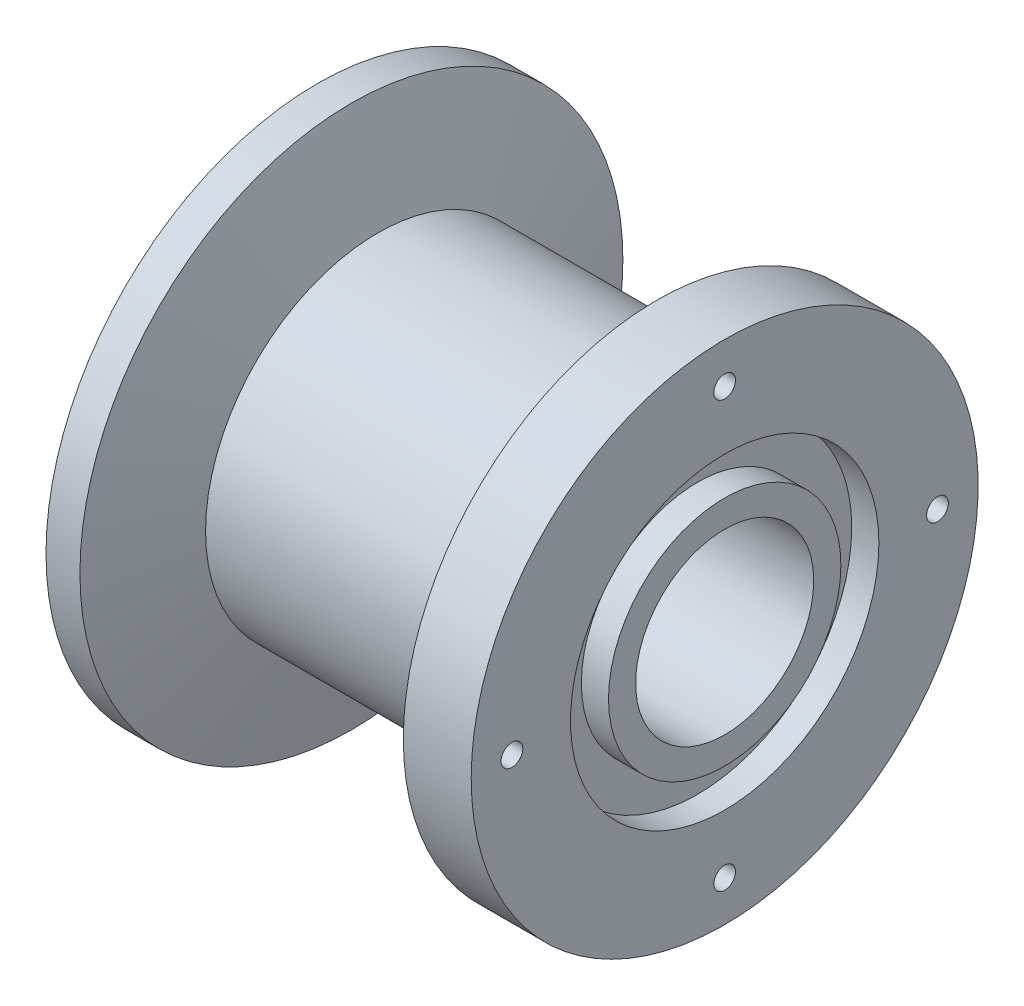
ISO-10303-21;
HEADER;
FILE_DESCRIPTION(('STEP AP214'),'2;1');
FILE_NAME('part.step','',(''),(''),'','','');
FILE_SCHEMA(('AUTOMOTIVE_DESIGN { 1 0 10303 214 1 1 1 1 }'));
ENDSEC;
DATA;
#1=APPLICATION_CONTEXT('core data for automotive mechanical design processes');
#2=APPLICATION_PROTOCOL_DEFINITION('international standard','automotive_design',2000,#1);
#3=PRODUCT_CONTEXT('',#1,'mechanical');
#4=PRODUCT('Part','Part','',(#3));
#5=PRODUCT_RELATED_PRODUCT_CATEGORY('part','',(#4));
#6=PRODUCT_DEFINITION_FORMATION('','',#4);
#7=PRODUCT_DEFINITION_CONTEXT('part definition',#1,'design');
#8=PRODUCT_DEFINITION('design','',#6,#7);
#9=PRODUCT_DEFINITION_SHAPE('','',#8);
#10=(LENGTH_UNIT() NAMED_UNIT(*) SI_UNIT(.MILLI.,.METRE.));
#11=(NAMED_UNIT(*) PLANE_ANGLE_UNIT() SI_UNIT($,.RADIAN.));
#12=(NAMED_UNIT(*) SI_UNIT($,.STERADIAN.) SOLID_ANGLE_UNIT());
#13=UNCERTAINTY_MEASURE_WITH_UNIT(LENGTH_MEASURE(1.E-05),#10,'distance_accuracy_value','');
#14=(GEOMETRIC_REPRESENTATION_CONTEXT(3) GLOBAL_UNCERTAINTY_ASSIGNED_CONTEXT((#13)) GLOBAL_UNIT_ASSIGNED_CONTEXT((#10,
#11,#12)) REPRESENTATION_CONTEXT('',''));
#15=CARTESIAN_POINT('',(0.,0.,0.));
#16=DIRECTION('',(0.,0.,1.));
#17=DIRECTION('',(1.,0.,0.));
#18=AXIS2_PLACEMENT_3D('',#15,#16,#17);
#19=CARTESIAN_POINT('',(27.9999999981352,0.,0.));
#20=DIRECTION('',(1.,0.,0.));
#21=DIRECTION('',(0.,0.,-1.));
#22=AXIS2_PLACEMENT_3D('',#19,#20,#21);
#23=CYLINDRICAL_SURFACE('',#22,11.3599999992398);
#24=CARTESIAN_POINT('',(29.999999998002,0.,0.));
#25=DIRECTION('',(1.,0.,0.));
#26=DIRECTION('',(0.,0.,-1.));
#27=AXIS2_PLACEMENT_3D('',#24,#25,#26);
#28=CIRCLE('',#27,11.3599999992398);
#29=CARTESIAN_POINT('',(29.999999998002,0.,-11.3599999992398));
#30=VERTEX_POINT('',#29);
#31=EDGE_CURVE('E36',#30,#30,#28,.T.);
#32=ORIENTED_EDGE('',*,*,#31,.T.);
#33=EDGE_LOOP('',(#32));
#34=FACE_BOUND('',#33,.T.);
#35=CARTESIAN_POINT('',(27.9999999981352,0.,0.));
#36=DIRECTION('',(1.,0.,0.));
#37=DIRECTION('',(0.,0.,-1.));
#38=AXIS2_PLACEMENT_3D('',#35,#36,#37);
#39=CIRCLE('',#38,11.3599999992398);
#40=CARTESIAN_POINT('',(27.9999999981352,0.,-11.3599999992398));
#41=VERTEX_POINT('',#40);
#42=EDGE_CURVE('E98',#41,#41,#39,.F.);
#43=ORIENTED_EDGE('',*,*,#42,.T.);
#44=EDGE_LOOP('',(#43));
#45=FACE_BOUND('',#44,.T.);
#46=ADVANCED_FACE('F32',(#34,#45),#23,.F.);
#47=CARTESIAN_POINT('',(29.999999998002,-19.4431846785478,19.4431846785478));
#48=DIRECTION('',(1.,0.,0.));
#49=DIRECTION('',(0.,0.,-1.));
#50=AXIS2_PLACEMENT_3D('',#47,#48,#49);
#51=PLANE('',#50);
#52=CARTESIAN_POINT('',(29.999999998002,-15.6749999989552,0.));
#53=DIRECTION('',(-1.,0.,0.));
#54=DIRECTION('',(0.,0.,1.));
#55=AXIS2_PLACEMENT_3D('',#52,#53,#54);
#56=CIRCLE('',#55,0.79999999993427);
#57=CARTESIAN_POINT('',(29.999999998002,-15.6749999989552,0.79999999993427));
#58=VERTEX_POINT('',#57);
#59=EDGE_CURVE('E84',#58,#58,#56,.T.);
#60=ORIENTED_EDGE('',*,*,#59,.T.);
#61=EDGE_LOOP('',(#60));
#62=FACE_BOUND('',#61,.T.);
#63=CARTESIAN_POINT('',(29.999999998002,0.,-15.6749999989552));
#64=DIRECTION('',(-1.,0.,0.));
#65=DIRECTION('',(0.,0.,1.));
#66=AXIS2_PLACEMENT_3D('',#63,#64,#65);
#67=CIRCLE('',#66,0.79999999993427);
#68=CARTESIAN_POINT('',(29.999999998002,0.,-14.8749999990209));
#69=VERTEX_POINT('',#68);
#70=EDGE_CURVE('E87',#69,#69,#67,.T.);
#71=ORIENTED_EDGE('',*,*,#70,.T.);
#72=EDGE_LOOP('',(#71));
#73=FACE_BOUND('',#72,.T.);
#74=CARTESIAN_POINT('',(29.999999998002,0.,15.6749999989552));
#75=DIRECTION('',(-1.,0.,0.));
#76=DIRECTION('',(0.,0.,1.));
#77=AXIS2_PLACEMENT_3D('',#74,#75,#76);
#78=CIRCLE('',#77,0.79999999993427);
#79=CARTESIAN_POINT('',(29.999999998002,0.,16.4749999988895));
#80=VERTEX_POINT('',#79);
#81=EDGE_CURVE('E90',#80,#80,#78,.T.);
#82=ORIENTED_EDGE('',*,*,#81,.T.);
#83=EDGE_LOOP('',(#82));
#84=FACE_BOUND('',#83,.T.);
#85=CARTESIAN_POINT('',(29.999999998002,15.6749999989552,0.));
#86=DIRECTION('',(-1.,0.,0.));
#87=DIRECTION('',(0.,0.,1.));
#88=AXIS2_PLACEMENT_3D('',#85,#86,#87);
#89=CIRCLE('',#88,0.79999999993427);
#90=CARTESIAN_POINT('',(29.999999998002,15.6749999989552,0.79999999993427));
#91=VERTEX_POINT('',#90);
#92=EDGE_CURVE('E93',#91,#91,#89,.T.);
#93=ORIENTED_EDGE('',*,*,#92,.T.);
#94=EDGE_LOOP('',(#93));
#95=FACE_BOUND('',#94,.T.);
#96=ORIENTED_EDGE('',*,*,#31,.F.);
#97=EDGE_LOOP('',(#96));
#98=FACE_BOUND('',#97,.T.);
#99=CARTESIAN_POINT('',(29.999999998002,0.,0.));
#100=DIRECTION('',(-1.,0.,0.));
#101=DIRECTION('',(0.,0.,1.));
#102=AXIS2_PLACEMENT_3D('',#99,#100,#101);
#103=CIRCLE('',#102,18.674999998809);
#104=CARTESIAN_POINT('',(29.999999998002,0.,18.674999998809));
#105=VERTEX_POINT('',#104);
#106=EDGE_CURVE('E96',#105,#105,#103,.F.);
#107=ORIENTED_EDGE('',*,*,#106,.T.);
#108=EDGE_LOOP('',(#107));
#109=FACE_BOUND('',#108,.T.);
#110=ADVANCED_FACE('F106',(#62,#73,#84,#95,#98,#109),#51,.T.);
#111=CARTESIAN_POINT('',(27.9999999981352,-11.8355846790573,11.8355846790573));
#112=DIRECTION('',(1.,0.,0.));
#113=DIRECTION('',(0.,0.,-1.));
#114=AXIS2_PLACEMENT_3D('',#111,#112,#113);
#115=PLANE('',#114);
#116=CARTESIAN_POINT('',(27.9999999981352,0.,0.));
#117=DIRECTION('',(-1.,0.,0.));
#118=DIRECTION('',(0.,0.,1.));
#119=AXIS2_PLACEMENT_3D('',#116,#117,#118);
#120=CIRCLE('',#119,8.55999999943655);
#121=CARTESIAN_POINT('',(27.9999999981352,0.,8.55999999943656));
#122=VERTEX_POINT('',#121);
#123=EDGE_CURVE('E81',#122,#122,#120,.T.);
#124=ORIENTED_EDGE('',*,*,#123,.T.);
#125=EDGE_LOOP('',(#124));
#126=FACE_BOUND('',#125,.T.);
#127=ORIENTED_EDGE('',*,*,#42,.F.);
#128=EDGE_LOOP('',(#127));
#129=FACE_BOUND('',#128,.T.);
#130=ADVANCED_FACE('F109',(#126,#129),#115,.T.);
#131=CARTESIAN_POINT('',(29.999999998002,0.,0.));
#132=DIRECTION('',(-1.,0.,0.));
#133=DIRECTION('',(0.,0.,1.));
#134=AXIS2_PLACEMENT_3D('',#131,#132,#133);
#135=CYLINDRICAL_SURFACE('',#134,18.674999998809);
#136=ORIENTED_EDGE('',*,*,#106,.F.);
#137=EDGE_LOOP('',(#136));
#138=FACE_BOUND('',#137,.T.);
#139=CARTESIAN_POINT('',(24.9999999983683,0.,0.));
#140=DIRECTION('',(-1.,0.,0.));
#141=DIRECTION('',(0.,0.,1.));
#142=AXIS2_PLACEMENT_3D('',#139,#140,#141);
#143=CIRCLE('',#142,18.674999998809);
#144=CARTESIAN_POINT('',(24.9999999983683,0.,18.674999998809));
#145=VERTEX_POINT('',#144);
#146=EDGE_CURVE('E78',#145,#145,#143,.F.);
#147=ORIENTED_EDGE('',*,*,#146,.T.);
#148=EDGE_LOOP('',(#147));
#149=FACE_BOUND('',#148,.T.);
#150=ADVANCED_FACE('F114',(#138,#149),#135,.T.);
#151=CARTESIAN_POINT('',(29.999999998002,15.6749999989552,0.));
#152=DIRECTION('',(-1.,0.,0.));
#153=DIRECTION('',(0.,0.,1.));
#154=AXIS2_PLACEMENT_3D('',#151,#152,#153);
#155=CYLINDRICAL_SURFACE('',#154,0.79999999993427);
#156=ORIENTED_EDGE('',*,*,#92,.F.);
#157=EDGE_LOOP('',(#156));
#158=FACE_BOUND('',#157,.T.);
#159=CARTESIAN_POINT('',(24.9999999983683,15.6749999989552,0.));
#160=DIRECTION('',(-1.,0.,0.));
#161=DIRECTION('',(0.,0.,1.));
#162=AXIS2_PLACEMENT_3D('',#159,#160,#161);
#163=CIRCLE('',#162,0.79999999993427);
#164=CARTESIAN_POINT('',(24.9999999983683,15.6749999989552,0.79999999993427));
#165=VERTEX_POINT('',#164);
#166=EDGE_CURVE('E75',#165,#165,#163,.T.);
#167=ORIENTED_EDGE('',*,*,#166,.T.);
#168=EDGE_LOOP('',(#167));
#169=FACE_BOUND('',#168,.T.);
#170=ADVANCED_FACE('F117',(#158,#169),#155,.F.);
#171=CARTESIAN_POINT('',(29.999999998002,0.,15.6749999989552));
#172=DIRECTION('',(-1.,0.,0.));
#173=DIRECTION('',(0.,0.,1.));
#174=AXIS2_PLACEMENT_3D('',#171,#172,#173);
#175=CYLINDRICAL_SURFACE('',#174,0.79999999993427);
#176=ORIENTED_EDGE('',*,*,#81,.F.);
#177=EDGE_LOOP('',(#176));
#178=FACE_BOUND('',#177,.T.);
#179=CARTESIAN_POINT('',(24.9999999983683,0.,15.6749999989552));
#180=DIRECTION('',(-1.,0.,0.));
#181=DIRECTION('',(0.,0.,1.));
#182=AXIS2_PLACEMENT_3D('',#179,#180,#181);
#183=CIRCLE('',#182,0.79999999993427);
#184=CARTESIAN_POINT('',(24.9999999983683,0.,16.4749999988895));
#185=VERTEX_POINT('',#184);
#186=EDGE_CURVE('E72',#185,#185,#183,.T.);
#187=ORIENTED_EDGE('',*,*,#186,.T.);
#188=EDGE_LOOP('',(#187));
#189=FACE_BOUND('',#188,.T.);
#190=ADVANCED_FACE('F256',(#178,#189),#175,.F.);
#191=CARTESIAN_POINT('',(29.999999998002,0.,-15.6749999989552));
#192=DIRECTION('',(-1.,0.,0.));
#193=DIRECTION('',(0.,0.,1.));
#194=AXIS2_PLACEMENT_3D('',#191,#192,#193);
#195=CYLINDRICAL_SURFACE('',#194,0.79999999993427);
#196=ORIENTED_EDGE('',*,*,#70,.F.);
#197=EDGE_LOOP('',(#196));
#198=FACE_BOUND('',#197,.T.);
#199=CARTESIAN_POINT('',(24.9999999983683,0.,-15.6749999989552));
#200=DIRECTION('',(-1.,0.,0.));
#201=DIRECTION('',(0.,0.,1.));
#202=AXIS2_PLACEMENT_3D('',#199,#200,#201);
#203=CIRCLE('',#202,0.79999999993427);
#204=CARTESIAN_POINT('',(24.9999999983683,0.,-14.8749999990209));
#205=VERTEX_POINT('',#204);
#206=EDGE_CURVE('E69',#205,#205,#203,.T.);
#207=ORIENTED_EDGE('',*,*,#206,.T.);
#208=EDGE_LOOP('',(#207));
#209=FACE_BOUND('',#208,.T.);
#210=ADVANCED_FACE('F263',(#198,#209),#195,.F.);
#211=CARTESIAN_POINT('',(29.999999998002,-15.6749999989552,0.));
#212=DIRECTION('',(-1.,0.,0.));
#213=DIRECTION('',(0.,0.,1.));
#214=AXIS2_PLACEMENT_3D('',#211,#212,#213);
#215=CYLINDRICAL_SURFACE('',#214,0.79999999993427);
#216=ORIENTED_EDGE('',*,*,#59,.F.);
#217=EDGE_LOOP('',(#216));
#218=FACE_BOUND('',#217,.T.);
#219=CARTESIAN_POINT('',(24.9999999983683,-15.6749999989552,0.));
#220=DIRECTION('',(-1.,0.,0.));
#221=DIRECTION('',(0.,0.,1.));
#222=AXIS2_PLACEMENT_3D('',#219,#220,#221);
#223=CIRCLE('',#222,0.79999999993427);
#224=CARTESIAN_POINT('',(24.9999999983683,-15.6749999989552,0.79999999993427));
#225=VERTEX_POINT('',#224);
#226=EDGE_CURVE('E66',#225,#225,#223,.T.);
#227=ORIENTED_EDGE('',*,*,#226,.T.);
#228=EDGE_LOOP('',(#227));
#229=FACE_BOUND('',#228,.T.);
#230=ADVANCED_FACE('F134',(#218,#229),#215,.F.);
#231=CARTESIAN_POINT('',(29.999999998002,0.,0.));
#232=DIRECTION('',(-1.,0.,0.));
#233=DIRECTION('',(0.,0.,1.));
#234=AXIS2_PLACEMENT_3D('',#231,#232,#233);
#235=CYLINDRICAL_SURFACE('',#234,8.55999999943655);
#236=ORIENTED_EDGE('',*,*,#123,.F.);
#237=EDGE_LOOP('',(#236));
#238=FACE_BOUND('',#237,.T.);
#239=CARTESIAN_POINT('',(29.999999998002,0.,0.));
#240=DIRECTION('',(-1.,0.,0.));
#241=DIRECTION('',(0.,0.,1.));
#242=AXIS2_PLACEMENT_3D('',#239,#240,#241);
#243=CIRCLE('',#242,8.55999999943655);
#244=CARTESIAN_POINT('',(29.999999998002,0.,8.55999999943656));
#245=VERTEX_POINT('',#244);
#246=EDGE_CURVE('E63',#245,#245,#243,.T.);
#247=ORIENTED_EDGE('',*,*,#246,.T.);
#248=EDGE_LOOP('',(#247));
#249=FACE_BOUND('',#248,.T.);
#250=ADVANCED_FACE('F124',(#238,#249),#235,.T.);
#251=CARTESIAN_POINT('',(24.9999999983683,-19.4431846785478,-19.4431846785478));
#252=DIRECTION('',(-1.,0.,0.));
#253=DIRECTION('',(0.,0.,1.));
#254=AXIS2_PLACEMENT_3D('',#251,#252,#253);
#255=PLANE('',#254);
#256=ORIENTED_EDGE('',*,*,#226,.F.);
#257=EDGE_LOOP('',(#256));
#258=FACE_BOUND('',#257,.T.);
#259=ORIENTED_EDGE('',*,*,#206,.F.);
#260=EDGE_LOOP('',(#259));
#261=FACE_BOUND('',#260,.T.);
#262=ORIENTED_EDGE('',*,*,#186,.F.);
#263=EDGE_LOOP('',(#262));
#264=FACE_BOUND('',#263,.T.);
#265=ORIENTED_EDGE('',*,*,#166,.F.);
#266=EDGE_LOOP('',(#265));
#267=FACE_BOUND('',#266,.T.);
#268=CARTESIAN_POINT('',(24.9999999983683,0.,0.));
#269=DIRECTION('',(-1.,0.,0.));
#270=DIRECTION('',(0.,0.,1.));
#271=AXIS2_PLACEMENT_3D('',#268,#269,#270);
#272=CIRCLE('',#271,12.6999999991647);
#273=CARTESIAN_POINT('',(24.9999999983683,0.,12.6999999991647));
#274=VERTEX_POINT('',#273);
#275=EDGE_CURVE('E60',#274,#274,#272,.F.);
#276=ORIENTED_EDGE('',*,*,#275,.T.);
#277=EDGE_LOOP('',(#276));
#278=FACE_BOUND('',#277,.T.);
#279=ORIENTED_EDGE('',*,*,#146,.F.);
#280=EDGE_LOOP('',(#279));
#281=FACE_BOUND('',#280,.T.);
#282=ADVANCED_FACE('F121',(#258,#261,#264,#267,#278,#281),#255,.T.);
#283=CARTESIAN_POINT('',(29.999999998002,-8.92358467919854,8.92358467919854));
#284=DIRECTION('',(1.,0.,0.));
#285=DIRECTION('',(0.,0.,-1.));
#286=AXIS2_PLACEMENT_3D('',#283,#284,#285);
#287=PLANE('',#286);
#288=CARTESIAN_POINT('',(29.999999998002,0.,0.));
#289=DIRECTION('',(1.,0.,0.));
#290=DIRECTION('',(0.,0.,-1.));
#291=AXIS2_PLACEMENT_3D('',#288,#289,#290);
#292=CIRCLE('',#291,6.55999999956758);
#293=CARTESIAN_POINT('',(29.999999998002,0.,-6.55999999956758));
#294=VERTEX_POINT('',#293);
#295=EDGE_CURVE('E57',#294,#294,#292,.F.);
#296=ORIENTED_EDGE('',*,*,#295,.T.);
#297=EDGE_LOOP('',(#296));
#298=FACE_BOUND('',#297,.T.);
#299=ORIENTED_EDGE('',*,*,#246,.F.);
#300=EDGE_LOOP('',(#299));
#301=FACE_BOUND('',#300,.T.);
#302=ADVANCED_FACE('F123',(#298,#301),#287,.T.);
#303=CARTESIAN_POINT('',(24.9999999983683,0.,0.));
#304=DIRECTION('',(-1.,0.,0.));
#305=DIRECTION('',(0.,0.,1.));
#306=AXIS2_PLACEMENT_3D('',#303,#304,#305);
#307=CYLINDRICAL_SURFACE('',#306,12.6999999991647);
#308=ORIENTED_EDGE('',*,*,#275,.F.);
#309=EDGE_LOOP('',(#308));
#310=FACE_BOUND('',#309,.T.);
#311=CARTESIAN_POINT('',(4.45602910446278,0.,0.));
#312=DIRECTION('',(-1.,0.,0.));
#313=DIRECTION('',(0.,0.,1.));
#314=AXIS2_PLACEMENT_3D('',#311,#312,#313);
#315=CIRCLE('',#314,12.6999999991647);
#316=CARTESIAN_POINT('',(4.45602910446278,0.,12.6999999991647));
#317=VERTEX_POINT('',#316);
#318=EDGE_CURVE('E48',#317,#317,#315,.F.);
#319=ORIENTED_EDGE('',*,*,#318,.T.);
#320=EDGE_LOOP('',(#319));
#321=FACE_BOUND('',#320,.T.);
#322=ADVANCED_FACE('F131',(#310,#321),#307,.T.);
#323=CARTESIAN_POINT('',(2.49999999985015,0.,0.));
#324=DIRECTION('',(1.,0.,0.));
#325=DIRECTION('',(0.,0.,-1.));
#326=AXIS2_PLACEMENT_3D('',#323,#324,#325);
#327=CYLINDRICAL_SURFACE('',#326,6.55999999956758);
#328=ORIENTED_EDGE('',*,*,#295,.F.);
#329=EDGE_LOOP('',(#328));
#330=FACE_BOUND('',#329,.T.);
#331=CARTESIAN_POINT('',(2.49999999985015,0.,0.));
#332=DIRECTION('',(1.,0.,0.));
#333=DIRECTION('',(0.,0.,-1.));
#334=AXIS2_PLACEMENT_3D('',#331,#332,#333);
#335=CIRCLE('',#334,6.55999999956758);
#336=CARTESIAN_POINT('',(2.49999999985015,0.,-6.55999999956758));
#337=VERTEX_POINT('',#336);
#338=EDGE_CURVE('E54',#337,#337,#335,.F.);
#339=ORIENTED_EDGE('',*,*,#338,.T.);
#340=EDGE_LOOP('',(#339));
#341=FACE_BOUND('',#340,.T.);
#342=ADVANCED_FACE('F164',(#330,#341),#327,.F.);
#343=CARTESIAN_POINT('',(2.49999999985015,0.,0.));
#344=DIRECTION('',(-1.,0.,0.));
#345=DIRECTION('',(0.,0.,1.));
#346=AXIS2_PLACEMENT_3D('',#343,#344,#345);
#347=CONICAL_SURFACE('',#346,19.999999998668,1.30899693899641);
#348=ORIENTED_EDGE('',*,*,#318,.F.);
#349=EDGE_LOOP('',(#348));
#350=FACE_BOUND('',#349,.T.);
#351=CARTESIAN_POINT('',(2.49999999985015,0.,0.));
#352=DIRECTION('',(-1.,0.,0.));
#353=DIRECTION('',(0.,0.,1.));
#354=AXIS2_PLACEMENT_3D('',#351,#352,#353);
#355=CIRCLE('',#354,19.9999999986898);
#356=CARTESIAN_POINT('',(2.49999999985015,0.,19.9999999986898));
#357=VERTEX_POINT('',#356);
#358=EDGE_CURVE('E53',#357,#357,#355,.F.);
#359=ORIENTED_EDGE('',*,*,#358,.T.);
#360=EDGE_LOOP('',(#359));
#361=FACE_BOUND('',#360,.T.);
#362=ADVANCED_FACE('F157',(#350,#361),#347,.T.);
#363=CARTESIAN_POINT('',(2.49999999985015,-13.7491846789018,-13.7491846789018));
#364=DIRECTION('',(-1.,0.,0.));
#365=DIRECTION('',(0.,0.,1.));
#366=AXIS2_PLACEMENT_3D('',#363,#364,#365);
#367=PLANE('',#366);
#368=ORIENTED_EDGE('',*,*,#338,.F.);
#369=EDGE_LOOP('',(#368));
#370=FACE_BOUND('',#369,.T.);
#371=CARTESIAN_POINT('',(2.49999999985015,0.,0.));
#372=DIRECTION('',(1.,0.,0.));
#373=DIRECTION('',(0.,0.,-1.));
#374=AXIS2_PLACEMENT_3D('',#371,#372,#373);
#375=CIRCLE('',#374,13.1999999991486);
#376=CARTESIAN_POINT('',(2.49999999985015,0.,-13.1999999991486));
#377=VERTEX_POINT('',#376);
#378=EDGE_CURVE('E45',#377,#377,#375,.F.);
#379=ORIENTED_EDGE('',*,*,#378,.T.);
#380=EDGE_LOOP('',(#379));
#381=FACE_BOUND('',#380,.T.);
#382=ADVANCED_FACE('F151',(#370,#381),#367,.T.);
#383=CARTESIAN_POINT('',(2.49999999985015,0.,0.));
#384=DIRECTION('',(-1.,0.,0.));
#385=DIRECTION('',(0.,0.,1.));
#386=AXIS2_PLACEMENT_3D('',#383,#384,#385);
#387=CYLINDRICAL_SURFACE('',#386,19.9999999986898);
#388=ORIENTED_EDGE('',*,*,#358,.F.);
#389=EDGE_LOOP('',(#388));
#390=FACE_BOUND('',#389,.T.);
#391=CARTESIAN_POINT('',(0.,0.,0.));
#392=DIRECTION('',(-1.,0.,0.));
#393=DIRECTION('',(0.,0.,1.));
#394=AXIS2_PLACEMENT_3D('',#391,#392,#393);
#395=CIRCLE('',#394,19.9999999986898);
#396=CARTESIAN_POINT('',(0.,0.,19.9999999986898));
#397=VERTEX_POINT('',#396);
#398=EDGE_CURVE('E40',#397,#397,#395,.F.);
#399=ORIENTED_EDGE('',*,*,#398,.T.);
#400=EDGE_LOOP('',(#399));
#401=FACE_BOUND('',#400,.T.);
#402=ADVANCED_FACE('F145',(#390,#401),#387,.T.);
#403=CARTESIAN_POINT('',(0.,0.,0.));
#404=DIRECTION('',(1.,0.,0.));
#405=DIRECTION('',(0.,0.,-1.));
#406=AXIS2_PLACEMENT_3D('',#403,#404,#405);
#407=CYLINDRICAL_SURFACE('',#406,13.1999999991486);
#408=ORIENTED_EDGE('',*,*,#378,.F.);
#409=EDGE_LOOP('',(#408));
#410=FACE_BOUND('',#409,.T.);
#411=CARTESIAN_POINT('',(0.,0.,0.));
#412=DIRECTION('',(1.,0.,0.));
#413=DIRECTION('',(0.,0.,-1.));
#414=AXIS2_PLACEMENT_3D('',#411,#412,#413);
#415=CIRCLE('',#414,13.1999999991486);
#416=CARTESIAN_POINT('',(0.,0.,-13.1999999991486));
#417=VERTEX_POINT('',#416);
#418=EDGE_CURVE('E10',#417,#417,#415,.F.);
#419=ORIENTED_EDGE('',*,*,#418,.T.);
#420=EDGE_LOOP('',(#419));
#421=FACE_BOUND('',#420,.T.);
#422=ADVANCED_FACE('F140',(#410,#421),#407,.F.);
#423=CARTESIAN_POINT('',(0.,-20.8211846784542,-20.8211846784542));
#424=DIRECTION('',(-1.,0.,0.));
#425=DIRECTION('',(0.,0.,1.));
#426=AXIS2_PLACEMENT_3D('',#423,#424,#425);
#427=PLANE('',#426);
#428=ORIENTED_EDGE('',*,*,#418,.F.);
#429=EDGE_LOOP('',(#428));
#430=FACE_BOUND('',#429,.T.);
#431=ORIENTED_EDGE('',*,*,#398,.F.);
#432=EDGE_LOOP('',(#431));
#433=FACE_BOUND('',#432,.T.);
#434=ADVANCED_FACE('F34',(#430,#433),#427,.T.);
#435=CLOSED_SHELL('',(#46,#110,#130,#150,#170,#190,#210,#230,#250,#282,#302,#322,#342,#362,#382,
#402,#422,#434));
#436=MANIFOLD_SOLID_BREP('B2',#435);
#437=ADVANCED_BREP_SHAPE_REPRESENTATION('',(#18,#436),#14);
#438=SHAPE_DEFINITION_REPRESENTATION(#9,#437);
ENDSEC;
END-ISO-10303-21;
